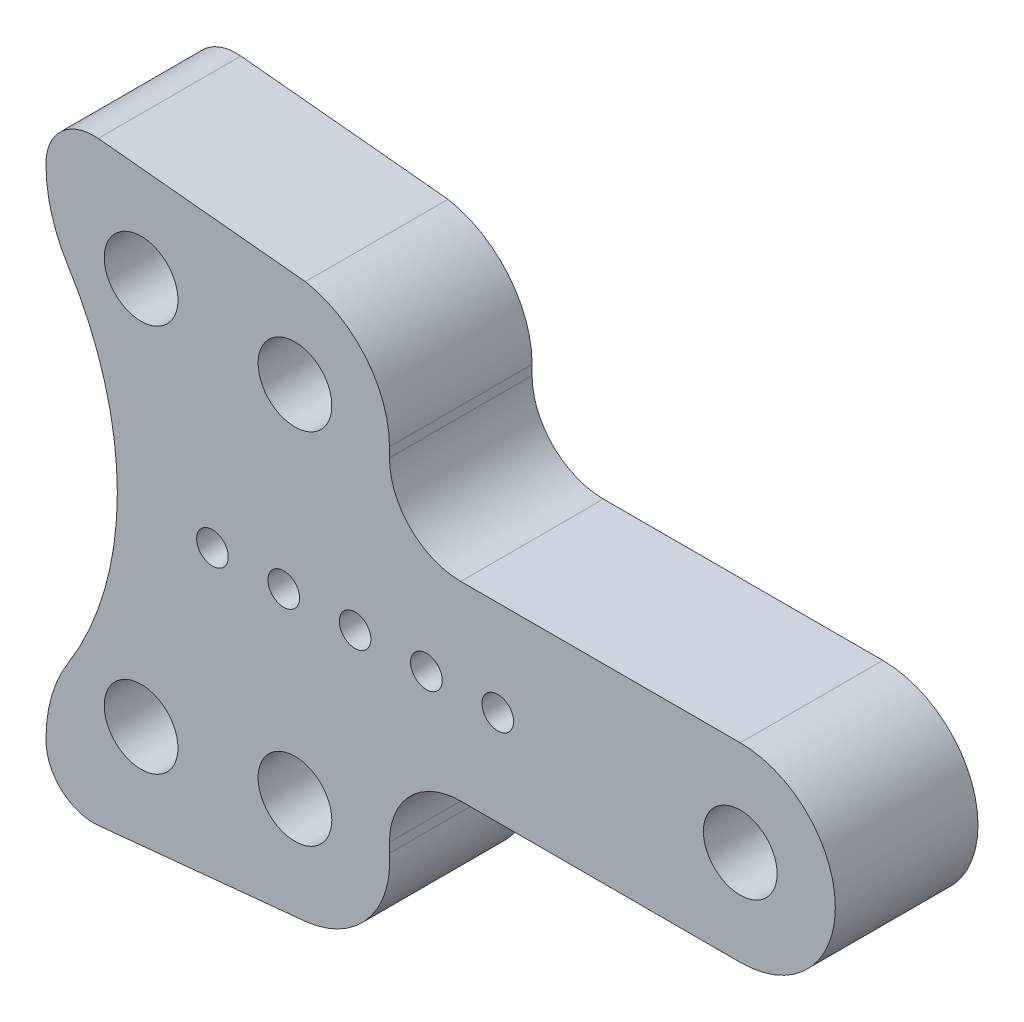
ISO-10303-21;
HEADER;
FILE_DESCRIPTION(('STEP AP214'),'2;1');
FILE_NAME('part.step','',(''),(''),'','','');
FILE_SCHEMA(('AUTOMOTIVE_DESIGN { 1 0 10303 214 1 1 1 1 }'));
ENDSEC;
DATA;
#1=APPLICATION_CONTEXT('core data for automotive mechanical design processes');
#2=APPLICATION_PROTOCOL_DEFINITION('international standard','automotive_design',2000,#1);
#3=PRODUCT_CONTEXT('',#1,'mechanical');
#4=PRODUCT('Part','Part','',(#3));
#5=PRODUCT_RELATED_PRODUCT_CATEGORY('part','',(#4));
#6=PRODUCT_DEFINITION_FORMATION('','',#4);
#7=PRODUCT_DEFINITION_CONTEXT('part definition',#1,'design');
#8=PRODUCT_DEFINITION('design','',#6,#7);
#9=PRODUCT_DEFINITION_SHAPE('','',#8);
#10=(LENGTH_UNIT() NAMED_UNIT(*) SI_UNIT(.MILLI.,.METRE.));
#11=(NAMED_UNIT(*) PLANE_ANGLE_UNIT() SI_UNIT($,.RADIAN.));
#12=(NAMED_UNIT(*) SI_UNIT($,.STERADIAN.) SOLID_ANGLE_UNIT());
#13=UNCERTAINTY_MEASURE_WITH_UNIT(LENGTH_MEASURE(1.E-05),#10,'distance_accuracy_value','');
#14=(GEOMETRIC_REPRESENTATION_CONTEXT(3) GLOBAL_UNCERTAINTY_ASSIGNED_CONTEXT((#13)) GLOBAL_UNIT_ASSIGNED_CONTEXT((#10,
#11,#12)) REPRESENTATION_CONTEXT('',''));
#15=CARTESIAN_POINT('',(0.,0.,0.));
#16=DIRECTION('',(0.,0.,1.));
#17=DIRECTION('',(1.,0.,0.));
#18=AXIS2_PLACEMENT_3D('',#15,#16,#17);
#19=CARTESIAN_POINT('',(-166.275426396836,1553.05348281574,6.));
#20=DIRECTION('',(0.,0.,-1.));
#21=DIRECTION('',(-1.,0.,0.));
#22=AXIS2_PLACEMENT_3D('',#19,#20,#21);
#23=PLANE('',#22);
#24=CARTESIAN_POINT('',(-185.004427546505,1545.64873675556,6.));
#25=DIRECTION('',(0.,0.,-1.));
#26=DIRECTION('',(1.,0.,0.));
#27=AXIS2_PLACEMENT_3D('',#24,#25,#26);
#28=CIRCLE('',#27,1.5500000000001);
#29=CARTESIAN_POINT('',(-183.454427546504,1545.64873675556,6.));
#30=VERTEX_POINT('',#29);
#31=EDGE_CURVE('E364',#30,#30,#28,.T.);
#32=ORIENTED_EDGE('',*,*,#31,.T.);
#33=EDGE_LOOP('',(#32));
#34=FACE_BOUND('',#33,.T.);
#35=CARTESIAN_POINT('',(-191.475426395173,1545.03540658304,6.));
#36=DIRECTION('',(0.,0.,-1.));
#37=DIRECTION('',(1.,0.,0.));
#38=AXIS2_PLACEMENT_3D('',#35,#36,#37);
#39=CIRCLE('',#38,1.5500000000001);
#40=CARTESIAN_POINT('',(-189.925426395173,1545.03540658304,6.));
#41=VERTEX_POINT('',#40);
#42=EDGE_CURVE('E356',#41,#41,#39,.T.);
#43=ORIENTED_EDGE('',*,*,#42,.T.);
#44=EDGE_LOOP('',(#43));
#45=FACE_BOUND('',#44,.T.);
#46=CARTESIAN_POINT('',(-191.475426395173,1561.35590317515,6.));
#47=DIRECTION('',(0.,0.,-1.));
#48=DIRECTION('',(-1.,0.,0.));
#49=AXIS2_PLACEMENT_3D('',#46,#47,#48);
#50=CIRCLE('',#49,1.5500000000001);
#51=CARTESIAN_POINT('',(-193.025426395173,1561.35590317515,6.));
#52=VERTEX_POINT('',#51);
#53=EDGE_CURVE('E348',#52,#52,#50,.T.);
#54=ORIENTED_EDGE('',*,*,#53,.T.);
#55=EDGE_LOOP('',(#54));
#56=FACE_BOUND('',#55,.T.);
#57=CARTESIAN_POINT('',(-185.004427546505,1560.74257300262,6.));
#58=DIRECTION('',(0.,0.,-1.));
#59=DIRECTION('',(-1.,0.,0.));
#60=AXIS2_PLACEMENT_3D('',#57,#58,#59);
#61=CIRCLE('',#60,1.5500000000001);
#62=CARTESIAN_POINT('',(-186.554427546505,1560.74257300262,6.));
#63=VERTEX_POINT('',#62);
#64=EDGE_CURVE('E343',#63,#63,#61,.T.);
#65=ORIENTED_EDGE('',*,*,#64,.T.);
#66=EDGE_LOOP('',(#65));
#67=FACE_BOUND('',#66,.T.);
#68=CARTESIAN_POINT('',(-176.475426396836,1553.05348281574,6.));
#69=DIRECTION('',(0.,0.,1.));
#70=DIRECTION('',(1.,0.,0.));
#71=AXIS2_PLACEMENT_3D('',#68,#69,#70);
#72=CIRCLE('',#71,0.665000000000046);
#73=CARTESIAN_POINT('',(-175.810426396836,1553.05348281574,6.));
#74=VERTEX_POINT('',#73);
#75=EDGE_CURVE('E335',#74,#74,#72,.T.);
#76=ORIENTED_EDGE('',*,*,#75,.F.);
#77=EDGE_LOOP('',(#76));
#78=FACE_BOUND('',#77,.T.);
#79=CARTESIAN_POINT('',(-179.475426396836,1553.05348281574,6.));
#80=DIRECTION('',(0.,0.,1.));
#81=DIRECTION('',(1.,0.,0.));
#82=AXIS2_PLACEMENT_3D('',#79,#80,#81);
#83=CIRCLE('',#82,0.665000000000046);
#84=CARTESIAN_POINT('',(-178.810426396836,1553.05348281574,6.));
#85=VERTEX_POINT('',#84);
#86=EDGE_CURVE('E327',#85,#85,#83,.T.);
#87=ORIENTED_EDGE('',*,*,#86,.F.);
#88=EDGE_LOOP('',(#87));
#89=FACE_BOUND('',#88,.T.);
#90=CARTESIAN_POINT('',(-182.475426396836,1553.05348281574,6.));
#91=DIRECTION('',(0.,0.,1.));
#92=DIRECTION('',(1.,0.,0.));
#93=AXIS2_PLACEMENT_3D('',#90,#91,#92);
#94=CIRCLE('',#93,0.665000000000046);
#95=CARTESIAN_POINT('',(-181.810426396836,1553.05348281574,6.));
#96=VERTEX_POINT('',#95);
#97=EDGE_CURVE('E319',#96,#96,#94,.T.);
#98=ORIENTED_EDGE('',*,*,#97,.F.);
#99=EDGE_LOOP('',(#98));
#100=FACE_BOUND('',#99,.T.);
#101=CARTESIAN_POINT('',(-185.475426396836,1553.05348281574,6.));
#102=DIRECTION('',(0.,0.,1.));
#103=DIRECTION('',(1.,0.,0.));
#104=AXIS2_PLACEMENT_3D('',#101,#102,#103);
#105=CIRCLE('',#104,0.665000000000046);
#106=CARTESIAN_POINT('',(-184.810426396836,1553.05348281574,6.));
#107=VERTEX_POINT('',#106);
#108=EDGE_CURVE('E311',#107,#107,#105,.T.);
#109=ORIENTED_EDGE('',*,*,#108,.F.);
#110=EDGE_LOOP('',(#109));
#111=FACE_BOUND('',#110,.T.);
#112=CARTESIAN_POINT('',(-188.475426396836,1553.05348281574,6.));
#113=DIRECTION('',(0.,0.,1.));
#114=DIRECTION('',(1.,0.,0.));
#115=AXIS2_PLACEMENT_3D('',#112,#113,#114);
#116=CIRCLE('',#115,0.665000000000046);
#117=CARTESIAN_POINT('',(-187.810426396836,1553.05348281574,6.));
#118=VERTEX_POINT('',#117);
#119=EDGE_CURVE('E307',#118,#118,#116,.T.);
#120=ORIENTED_EDGE('',*,*,#119,.F.);
#121=EDGE_LOOP('',(#120));
#122=FACE_BOUND('',#121,.T.);
#123=DIRECTION('',(-1.,0.,0.));
#124=VECTOR('',#123,1.);
#125=CARTESIAN_POINT('',(-188.475426396836,1557.05348281574,6.));
#126=LINE('',#125,#124);
#127=CARTESIAN_POINT('',(-166.275426396836,1557.05348281574,6.));
#128=VERTEX_POINT('',#127);
#129=CARTESIAN_POINT('',(-178.029706775173,1557.05348281574,6.));
#130=VERTEX_POINT('',#129);
#131=EDGE_CURVE('E119',#128,#130,#126,.T.);
#132=ORIENTED_EDGE('',*,*,#131,.T.);
#133=CARTESIAN_POINT('',(-178.029706775165,1560.05348281574,6.));
#134=DIRECTION('',(0.,0.,-1.));
#135=DIRECTION('',(1.,0.,0.));
#136=AXIS2_PLACEMENT_3D('',#133,#134,#135);
#137=CIRCLE('',#136,2.99999999999995);
#138=CARTESIAN_POINT('',(-181.029706775165,1560.05348281574,6.));
#139=VERTEX_POINT('',#138);
#140=EDGE_CURVE('E228',#130,#139,#137,.T.);
#141=ORIENTED_EDGE('',*,*,#140,.T.);
#142=DIRECTION('',(0.,1.,0.));
#143=VECTOR('',#142,1.);
#144=CARTESIAN_POINT('',(-181.029706775165,1560.05348281574,6.));
#145=LINE('',#144,#143);
#146=CARTESIAN_POINT('',(-181.029706775165,1560.45822887591,6.));
#147=VERTEX_POINT('',#146);
#148=EDGE_CURVE('E224',#139,#147,#145,.T.);
#149=ORIENTED_EDGE('',*,*,#148,.T.);
#150=CARTESIAN_POINT('',(-185.347683387734,1560.45822887591,6.));
#151=DIRECTION('',(0.,0.,1.));
#152=DIRECTION('',(-1.,0.,0.));
#153=AXIS2_PLACEMENT_3D('',#150,#151,#152);
#154=CIRCLE('',#153,4.31797661256833);
#155=CARTESIAN_POINT('',(-184.565954248371,1564.70485360378,6.));
#156=VERTEX_POINT('',#155);
#157=EDGE_CURVE('E220',#147,#156,#154,.T.);
#158=ORIENTED_EDGE('',*,*,#157,.T.);
#159=DIRECTION('',(-0.995162407068543,0.0982434911713944,0.));
#160=VECTOR('',#159,1.);
#161=CARTESIAN_POINT('',(-191.112699272425,1565.35115523495,6.));
#162=LINE('',#161,#160);
#163=CARTESIAN_POINT('',(-193.278939414494,1565.56500876555,6.));
#164=VERTEX_POINT('',#163);
#165=EDGE_CURVE('E216',#156,#164,#162,.T.);
#166=ORIENTED_EDGE('',*,*,#165,.T.);
#167=CARTESIAN_POINT('',(-193.475426396836,1563.57468395142,6.));
#168=DIRECTION('',(0.,0.,1.));
#169=DIRECTION('',(-1.,0.,0.));
#170=AXIS2_PLACEMENT_3D('',#167,#168,#169);
#171=CIRCLE('',#170,1.99999999999988);
#172=CARTESIAN_POINT('',(-195.475426396836,1563.57468395142,6.));
#173=VERTEX_POINT('',#172);
#174=EDGE_CURVE('E212',#164,#173,#171,.T.);
#175=ORIENTED_EDGE('',*,*,#174,.T.);
#176=DIRECTION('',(3.52368216721944E-13,-1.,0.));
#177=VECTOR('',#176,1.);
#178=CARTESIAN_POINT('',(-195.475426396836,1563.49591528189,6.));
#179=LINE('',#178,#177);
#180=CARTESIAN_POINT('',(-195.475426396836,1563.49591528189,6.));
#181=VERTEX_POINT('',#180);
#182=EDGE_CURVE('E208',#173,#181,#179,.T.);
#183=ORIENTED_EDGE('',*,*,#182,.T.);
#184=CARTESIAN_POINT('',(-189.475426396836,1563.49591528189,6.));
#185=DIRECTION('',(0.,0.,1.));
#186=DIRECTION('',(-1.,0.,0.));
#187=AXIS2_PLACEMENT_3D('',#184,#185,#186);
#188=CIRCLE('',#187,6.00000000000002);
#189=CARTESIAN_POINT('',(-194.560516381338,1560.31128659874,6.));
#190=VERTEX_POINT('',#189);
#191=EDGE_CURVE('E204',#181,#190,#188,.T.);
#192=ORIENTED_EDGE('',*,*,#191,.T.);
#193=CARTESIAN_POINT('',(-206.149492365173,1553.05348281574,6.));
#194=DIRECTION('',(0.,0.,-1.));
#195=DIRECTION('',(1.,0.,0.));
#196=AXIS2_PLACEMENT_3D('',#193,#194,#195);
#197=CIRCLE('',#196,13.6740659683367);
#198=CARTESIAN_POINT('',(-194.560516381338,1545.79567903274,6.));
#199=VERTEX_POINT('',#198);
#200=EDGE_CURVE('E200',#190,#199,#197,.T.);
#201=ORIENTED_EDGE('',*,*,#200,.T.);
#202=CARTESIAN_POINT('',(-189.475426396836,1542.61105034959,6.));
#203=DIRECTION('',(0.,0.,1.));
#204=DIRECTION('',(-1.,0.,0.));
#205=AXIS2_PLACEMENT_3D('',#202,#203,#204);
#206=CIRCLE('',#205,6.00000000000002);
#207=CARTESIAN_POINT('',(-195.475426396836,1542.61105034959,6.));
#208=VERTEX_POINT('',#207);
#209=EDGE_CURVE('E196',#199,#208,#206,.T.);
#210=ORIENTED_EDGE('',*,*,#209,.T.);
#211=DIRECTION('',(0.,-1.,0.));
#212=VECTOR('',#211,1.);
#213=CARTESIAN_POINT('',(-195.475426396836,1542.53228168014,6.));
#214=LINE('',#213,#212);
#215=CARTESIAN_POINT('',(-195.475426396836,1542.53228168014,6.));
#216=VERTEX_POINT('',#215);
#217=EDGE_CURVE('E191',#208,#216,#214,.T.);
#218=ORIENTED_EDGE('',*,*,#217,.T.);
#219=CARTESIAN_POINT('',(-193.475426396836,1542.53228168014,6.));
#220=DIRECTION('',(0.,0.,1.));
#221=DIRECTION('',(1.,0.,0.));
#222=AXIS2_PLACEMENT_3D('',#219,#220,#221);
#223=CIRCLE('',#222,2.);
#224=CARTESIAN_POINT('',(-193.278939414493,1540.541956866,6.));
#225=VERTEX_POINT('',#224);
#226=EDGE_CURVE('E245',#216,#225,#223,.T.);
#227=ORIENTED_EDGE('',*,*,#226,.T.);
#228=DIRECTION('',(0.995162407068538,0.0982434911714458,0.));
#229=VECTOR('',#228,1.);
#230=CARTESIAN_POINT('',(-184.565954248368,1541.40211202778,6.));
#231=LINE('',#230,#229);
#232=CARTESIAN_POINT('',(-184.565954248368,1541.40211202778,6.));
#233=VERTEX_POINT('',#232);
#234=EDGE_CURVE('E241',#225,#233,#231,.T.);
#235=ORIENTED_EDGE('',*,*,#234,.T.);
#236=CARTESIAN_POINT('',(-184.993467934784,1545.35377461965,6.));
#237=DIRECTION('',(0.,0.,1.));
#238=DIRECTION('',(1.,0.,0.));
#239=AXIS2_PLACEMENT_3D('',#236,#237,#238);
#240=CIRCLE('',#239,3.97472076906977);
#241=CARTESIAN_POINT('',(-181.029706775172,1545.64873675557,6.));
#242=VERTEX_POINT('',#241);
#243=EDGE_CURVE('E237',#233,#242,#240,.T.);
#244=ORIENTED_EDGE('',*,*,#243,.T.);
#245=DIRECTION('',(0.,1.,0.));
#246=VECTOR('',#245,1.);
#247=CARTESIAN_POINT('',(-181.029706775172,1546.05348281574,6.));
#248=LINE('',#247,#246);
#249=CARTESIAN_POINT('',(-181.029706775172,1546.05348281574,6.));
#250=VERTEX_POINT('',#249);
#251=EDGE_CURVE('E234',#242,#250,#248,.T.);
#252=ORIENTED_EDGE('',*,*,#251,.T.);
#253=CARTESIAN_POINT('',(-178.029706775172,1546.05348281574,6.));
#254=DIRECTION('',(0.,0.,-1.));
#255=DIRECTION('',(-1.,0.,0.));
#256=AXIS2_PLACEMENT_3D('',#253,#254,#255);
#257=CIRCLE('',#256,2.99999999999992);
#258=CARTESIAN_POINT('',(-178.029706775173,1549.05348281574,6.));
#259=VERTEX_POINT('',#258);
#260=EDGE_CURVE('E59',#250,#259,#257,.T.);
#261=ORIENTED_EDGE('',*,*,#260,.T.);
#262=DIRECTION('',(1.,0.,0.));
#263=VECTOR('',#262,1.);
#264=CARTESIAN_POINT('',(-166.275426396836,1549.05348281574,6.));
#265=LINE('',#264,#263);
#266=CARTESIAN_POINT('',(-166.275426396836,1549.05348281574,6.));
#267=VERTEX_POINT('',#266);
#268=EDGE_CURVE('E68',#259,#267,#265,.T.);
#269=ORIENTED_EDGE('',*,*,#268,.T.);
#270=CARTESIAN_POINT('',(-166.275426396836,1553.05348281574,6.));
#271=DIRECTION('',(0.,0.,1.));
#272=DIRECTION('',(-1.,0.,0.));
#273=AXIS2_PLACEMENT_3D('',#270,#271,#272);
#274=CIRCLE('',#273,4.);
#275=EDGE_CURVE('E94',#267,#128,#274,.T.);
#276=ORIENTED_EDGE('',*,*,#275,.T.);
#277=EDGE_LOOP('',(#132,#141,#149,#158,#166,#175,#183,#192,#201,#210,#218,#227,#235,#244,#252,
#261,#269,#276));
#278=FACE_BOUND('',#277,.T.);
#279=CARTESIAN_POINT('',(-166.275426396836,1553.05348281574,6.));
#280=DIRECTION('',(0.,0.,1.));
#281=DIRECTION('',(1.,0.,0.));
#282=AXIS2_PLACEMENT_3D('',#279,#280,#281);
#283=CIRCLE('',#282,1.5500000000001);
#284=CARTESIAN_POINT('',(-164.725426396836,1553.05348281574,6.));
#285=VERTEX_POINT('',#284);
#286=EDGE_CURVE('E108',#285,#285,#283,.T.);
#287=ORIENTED_EDGE('',*,*,#286,.F.);
#288=EDGE_LOOP('',(#287));
#289=FACE_BOUND('',#288,.T.);
#290=ADVANCED_FACE('F39',(#34,#45,#56,#67,#78,#89,#100,#111,#122,#278,#289),#23,.F.);
#291=CARTESIAN_POINT('',(-166.275426396836,1553.05348281574,0.));
#292=DIRECTION('',(0.,0.,-1.));
#293=DIRECTION('',(-1.,0.,0.));
#294=AXIS2_PLACEMENT_3D('',#291,#292,#293);
#295=PLANE('',#294);
#296=CARTESIAN_POINT('',(-185.004427546505,1545.64873675556,0.));
#297=DIRECTION('',(0.,0.,-1.));
#298=DIRECTION('',(1.,0.,0.));
#299=AXIS2_PLACEMENT_3D('',#296,#297,#298);
#300=CIRCLE('',#299,1.5500000000001);
#301=CARTESIAN_POINT('',(-183.454427546504,1545.64873675556,0.));
#302=VERTEX_POINT('',#301);
#303=EDGE_CURVE('E368',#302,#302,#300,.T.);
#304=ORIENTED_EDGE('',*,*,#303,.F.);
#305=EDGE_LOOP('',(#304));
#306=FACE_BOUND('',#305,.T.);
#307=CARTESIAN_POINT('',(-191.475426395173,1545.03540658304,0.));
#308=DIRECTION('',(0.,0.,-1.));
#309=DIRECTION('',(1.,0.,0.));
#310=AXIS2_PLACEMENT_3D('',#307,#308,#309);
#311=CIRCLE('',#310,1.5500000000001);
#312=CARTESIAN_POINT('',(-189.925426395173,1545.03540658304,0.));
#313=VERTEX_POINT('',#312);
#314=EDGE_CURVE('E360',#313,#313,#311,.T.);
#315=ORIENTED_EDGE('',*,*,#314,.F.);
#316=EDGE_LOOP('',(#315));
#317=FACE_BOUND('',#316,.T.);
#318=CARTESIAN_POINT('',(-191.475426395173,1561.35590317515,0.));
#319=DIRECTION('',(0.,0.,-1.));
#320=DIRECTION('',(-1.,0.,0.));
#321=AXIS2_PLACEMENT_3D('',#318,#319,#320);
#322=CIRCLE('',#321,1.5500000000001);
#323=CARTESIAN_POINT('',(-193.025426395173,1561.35590317515,0.));
#324=VERTEX_POINT('',#323);
#325=EDGE_CURVE('E352',#324,#324,#322,.T.);
#326=ORIENTED_EDGE('',*,*,#325,.F.);
#327=EDGE_LOOP('',(#326));
#328=FACE_BOUND('',#327,.T.);
#329=CARTESIAN_POINT('',(-185.004427546505,1560.74257300262,0.));
#330=DIRECTION('',(0.,0.,-1.));
#331=DIRECTION('',(-1.,0.,0.));
#332=AXIS2_PLACEMENT_3D('',#329,#330,#331);
#333=CIRCLE('',#332,1.5500000000001);
#334=CARTESIAN_POINT('',(-186.554427546505,1560.74257300262,0.));
#335=VERTEX_POINT('',#334);
#336=EDGE_CURVE('E344',#335,#335,#333,.T.);
#337=ORIENTED_EDGE('',*,*,#336,.F.);
#338=EDGE_LOOP('',(#337));
#339=FACE_BOUND('',#338,.T.);
#340=CARTESIAN_POINT('',(-176.475426396836,1553.05348281574,0.));
#341=DIRECTION('',(0.,0.,-1.));
#342=DIRECTION('',(-1.,0.,0.));
#343=AXIS2_PLACEMENT_3D('',#340,#341,#342);
#344=CIRCLE('',#343,0.665000000000046);
#345=CARTESIAN_POINT('',(-177.140426396836,1553.05348281574,0.));
#346=VERTEX_POINT('',#345);
#347=EDGE_CURVE('E339',#346,#346,#344,.T.);
#348=ORIENTED_EDGE('',*,*,#347,.F.);
#349=EDGE_LOOP('',(#348));
#350=FACE_BOUND('',#349,.T.);
#351=CARTESIAN_POINT('',(-179.475426396836,1553.05348281574,0.));
#352=DIRECTION('',(0.,0.,-1.));
#353=DIRECTION('',(-1.,0.,0.));
#354=AXIS2_PLACEMENT_3D('',#351,#352,#353);
#355=CIRCLE('',#354,0.665000000000046);
#356=CARTESIAN_POINT('',(-180.140426396836,1553.05348281574,0.));
#357=VERTEX_POINT('',#356);
#358=EDGE_CURVE('E331',#357,#357,#355,.T.);
#359=ORIENTED_EDGE('',*,*,#358,.F.);
#360=EDGE_LOOP('',(#359));
#361=FACE_BOUND('',#360,.T.);
#362=CARTESIAN_POINT('',(-182.475426396836,1553.05348281574,0.));
#363=DIRECTION('',(0.,0.,-1.));
#364=DIRECTION('',(-1.,0.,0.));
#365=AXIS2_PLACEMENT_3D('',#362,#363,#364);
#366=CIRCLE('',#365,0.665000000000046);
#367=CARTESIAN_POINT('',(-183.140426396836,1553.05348281574,0.));
#368=VERTEX_POINT('',#367);
#369=EDGE_CURVE('E323',#368,#368,#366,.T.);
#370=ORIENTED_EDGE('',*,*,#369,.F.);
#371=EDGE_LOOP('',(#370));
#372=FACE_BOUND('',#371,.T.);
#373=CARTESIAN_POINT('',(-185.475426396836,1553.05348281574,0.));
#374=DIRECTION('',(0.,0.,-1.));
#375=DIRECTION('',(-1.,0.,0.));
#376=AXIS2_PLACEMENT_3D('',#373,#374,#375);
#377=CIRCLE('',#376,0.665000000000046);
#378=CARTESIAN_POINT('',(-186.140426396836,1553.05348281574,0.));
#379=VERTEX_POINT('',#378);
#380=EDGE_CURVE('E315',#379,#379,#377,.T.);
#381=ORIENTED_EDGE('',*,*,#380,.F.);
#382=EDGE_LOOP('',(#381));
#383=FACE_BOUND('',#382,.T.);
#384=CARTESIAN_POINT('',(-188.475426396836,1553.05348281574,0.));
#385=DIRECTION('',(0.,0.,-1.));
#386=DIRECTION('',(-1.,0.,0.));
#387=AXIS2_PLACEMENT_3D('',#384,#385,#386);
#388=CIRCLE('',#387,0.665000000000046);
#389=CARTESIAN_POINT('',(-189.140426396836,1553.05348281574,0.));
#390=VERTEX_POINT('',#389);
#391=EDGE_CURVE('E43',#390,#390,#388,.T.);
#392=ORIENTED_EDGE('',*,*,#391,.F.);
#393=EDGE_LOOP('',(#392));
#394=FACE_BOUND('',#393,.T.);
#395=DIRECTION('',(1.,0.,0.));
#396=VECTOR('',#395,1.);
#397=CARTESIAN_POINT('',(-166.275426396836,1549.05348281574,0.));
#398=LINE('',#397,#396);
#399=CARTESIAN_POINT('',(-178.029706775173,1549.05348281574,0.));
#400=VERTEX_POINT('',#399);
#401=CARTESIAN_POINT('',(-166.275426396836,1549.05348281574,0.));
#402=VERTEX_POINT('',#401);
#403=EDGE_CURVE('E84',#400,#402,#398,.T.);
#404=ORIENTED_EDGE('',*,*,#403,.F.);
#405=CARTESIAN_POINT('',(-178.029706775172,1546.05348281574,0.));
#406=DIRECTION('',(0.,0.,-1.));
#407=DIRECTION('',(-1.,0.,0.));
#408=AXIS2_PLACEMENT_3D('',#405,#406,#407);
#409=CIRCLE('',#408,2.99999999999992);
#410=CARTESIAN_POINT('',(-181.029706775172,1546.05348281574,0.));
#411=VERTEX_POINT('',#410);
#412=EDGE_CURVE('E288',#411,#400,#409,.T.);
#413=ORIENTED_EDGE('',*,*,#412,.F.);
#414=DIRECTION('',(0.,1.,0.));
#415=VECTOR('',#414,1.);
#416=CARTESIAN_POINT('',(-181.029706775172,1546.05348281574,0.));
#417=LINE('',#416,#415);
#418=CARTESIAN_POINT('',(-181.029706775172,1545.64873675557,0.));
#419=VERTEX_POINT('',#418);
#420=EDGE_CURVE('E292',#419,#411,#417,.T.);
#421=ORIENTED_EDGE('',*,*,#420,.F.);
#422=CARTESIAN_POINT('',(-184.993467934784,1545.35377461965,0.));
#423=DIRECTION('',(0.,0.,1.));
#424=DIRECTION('',(1.,0.,0.));
#425=AXIS2_PLACEMENT_3D('',#422,#423,#424);
#426=CIRCLE('',#425,3.97472076906977);
#427=CARTESIAN_POINT('',(-184.565954248368,1541.40211202778,0.));
#428=VERTEX_POINT('',#427);
#429=EDGE_CURVE('E296',#428,#419,#426,.T.);
#430=ORIENTED_EDGE('',*,*,#429,.F.);
#431=DIRECTION('',(0.995162407068542,0.0982434911714071,0.));
#432=VECTOR('',#431,1.);
#433=CARTESIAN_POINT('',(-188.141654626991,1541.04911508368,0.));
#434=LINE('',#433,#432);
#435=CARTESIAN_POINT('',(-193.278939414493,1540.541956866,0.));
#436=VERTEX_POINT('',#435);
#437=EDGE_CURVE('E300',#436,#428,#434,.T.);
#438=ORIENTED_EDGE('',*,*,#437,.F.);
#439=CARTESIAN_POINT('',(-193.475426396836,1542.53228168014,0.));
#440=DIRECTION('',(0.,0.,1.));
#441=DIRECTION('',(1.,0.,0.));
#442=AXIS2_PLACEMENT_3D('',#439,#440,#441);
#443=CIRCLE('',#442,2.);
#444=CARTESIAN_POINT('',(-195.475426396836,1542.53228168014,0.));
#445=VERTEX_POINT('',#444);
#446=EDGE_CURVE('E195',#445,#436,#443,.T.);
#447=ORIENTED_EDGE('',*,*,#446,.F.);
#448=DIRECTION('',(0.,-1.,0.));
#449=VECTOR('',#448,1.);
#450=CARTESIAN_POINT('',(-195.475426396836,1542.53228168014,0.));
#451=LINE('',#450,#449);
#452=CARTESIAN_POINT('',(-195.475426396836,1542.61105034959,0.));
#453=VERTEX_POINT('',#452);
#454=EDGE_CURVE('E134',#453,#445,#451,.T.);
#455=ORIENTED_EDGE('',*,*,#454,.F.);
#456=CARTESIAN_POINT('',(-189.475426396836,1542.61105034959,0.));
#457=DIRECTION('',(0.,0.,1.));
#458=DIRECTION('',(-1.,0.,0.));
#459=AXIS2_PLACEMENT_3D('',#456,#457,#458);
#460=CIRCLE('',#459,6.00000000000002);
#461=CARTESIAN_POINT('',(-194.560516381338,1545.79567903274,0.));
#462=VERTEX_POINT('',#461);
#463=EDGE_CURVE('E252',#462,#453,#460,.T.);
#464=ORIENTED_EDGE('',*,*,#463,.F.);
#465=CARTESIAN_POINT('',(-206.149492365173,1553.05348281574,0.));
#466=DIRECTION('',(0.,0.,-1.));
#467=DIRECTION('',(1.,0.,0.));
#468=AXIS2_PLACEMENT_3D('',#465,#466,#467);
#469=CIRCLE('',#468,13.6740659683367);
#470=CARTESIAN_POINT('',(-194.560516381338,1560.31128659874,0.));
#471=VERTEX_POINT('',#470);
#472=EDGE_CURVE('E256',#471,#462,#469,.T.);
#473=ORIENTED_EDGE('',*,*,#472,.F.);
#474=CARTESIAN_POINT('',(-189.475426396836,1563.49591528189,0.));
#475=DIRECTION('',(0.,0.,1.));
#476=DIRECTION('',(-1.,0.,0.));
#477=AXIS2_PLACEMENT_3D('',#474,#475,#476);
#478=CIRCLE('',#477,6.00000000000002);
#479=CARTESIAN_POINT('',(-195.475426396836,1563.49591528189,0.));
#480=VERTEX_POINT('',#479);
#481=EDGE_CURVE('E260',#480,#471,#478,.T.);
#482=ORIENTED_EDGE('',*,*,#481,.F.);
#483=DIRECTION('',(3.52368216721944E-13,-1.,0.));
#484=VECTOR('',#483,1.);
#485=CARTESIAN_POINT('',(-195.475426396836,1563.49591528189,0.));
#486=LINE('',#485,#484);
#487=CARTESIAN_POINT('',(-195.475426396836,1563.57468395142,0.));
#488=VERTEX_POINT('',#487);
#489=EDGE_CURVE('E264',#488,#480,#486,.T.);
#490=ORIENTED_EDGE('',*,*,#489,.F.);
#491=CARTESIAN_POINT('',(-193.475426396836,1563.57468395142,0.));
#492=DIRECTION('',(0.,0.,1.));
#493=DIRECTION('',(-1.,0.,0.));
#494=AXIS2_PLACEMENT_3D('',#491,#492,#493);
#495=CIRCLE('',#494,1.99999999999988);
#496=CARTESIAN_POINT('',(-193.278939414494,1565.56500876555,0.));
#497=VERTEX_POINT('',#496);
#498=EDGE_CURVE('E268',#497,#488,#495,.T.);
#499=ORIENTED_EDGE('',*,*,#498,.F.);
#500=DIRECTION('',(-0.995162407068545,0.0982434911713713,0.));
#501=VECTOR('',#500,1.);
#502=CARTESIAN_POINT('',(-184.565954248371,1564.70485360378,0.));
#503=LINE('',#502,#501);
#504=CARTESIAN_POINT('',(-184.565954248371,1564.70485360378,0.));
#505=VERTEX_POINT('',#504);
#506=EDGE_CURVE('E272',#505,#497,#503,.T.);
#507=ORIENTED_EDGE('',*,*,#506,.F.);
#508=CARTESIAN_POINT('',(-185.347683387734,1560.45822887591,0.));
#509=DIRECTION('',(0.,0.,1.));
#510=DIRECTION('',(-1.,0.,0.));
#511=AXIS2_PLACEMENT_3D('',#508,#509,#510);
#512=CIRCLE('',#511,4.31797661256833);
#513=CARTESIAN_POINT('',(-181.029706775165,1560.45822887591,0.));
#514=VERTEX_POINT('',#513);
#515=EDGE_CURVE('E276',#514,#505,#512,.T.);
#516=ORIENTED_EDGE('',*,*,#515,.F.);
#517=DIRECTION('',(0.,1.,0.));
#518=VECTOR('',#517,1.);
#519=CARTESIAN_POINT('',(-181.029706775165,1560.05348281574,0.));
#520=LINE('',#519,#518);
#521=CARTESIAN_POINT('',(-181.029706775165,1560.05348281574,0.));
#522=VERTEX_POINT('',#521);
#523=EDGE_CURVE('E280',#522,#514,#520,.T.);
#524=ORIENTED_EDGE('',*,*,#523,.F.);
#525=CARTESIAN_POINT('',(-178.029706775165,1560.05348281574,0.));
#526=DIRECTION('',(0.,0.,-1.));
#527=DIRECTION('',(1.,0.,0.));
#528=AXIS2_PLACEMENT_3D('',#525,#526,#527);
#529=CIRCLE('',#528,2.99999999999995);
#530=CARTESIAN_POINT('',(-178.029706775173,1557.05348281574,0.));
#531=VERTEX_POINT('',#530);
#532=EDGE_CURVE('E284',#531,#522,#529,.T.);
#533=ORIENTED_EDGE('',*,*,#532,.F.);
#534=DIRECTION('',(-1.,0.,0.));
#535=VECTOR('',#534,1.);
#536=CARTESIAN_POINT('',(-188.475426396836,1557.05348281574,0.));
#537=LINE('',#536,#535);
#538=CARTESIAN_POINT('',(-166.275426396836,1557.05348281574,0.));
#539=VERTEX_POINT('',#538);
#540=EDGE_CURVE('E95',#539,#531,#537,.T.);
#541=ORIENTED_EDGE('',*,*,#540,.F.);
#542=CARTESIAN_POINT('',(-166.275426396836,1553.05348281574,0.));
#543=DIRECTION('',(0.,0.,1.));
#544=DIRECTION('',(-1.,0.,0.));
#545=AXIS2_PLACEMENT_3D('',#542,#543,#544);
#546=CIRCLE('',#545,4.);
#547=EDGE_CURVE('E100',#402,#539,#546,.T.);
#548=ORIENTED_EDGE('',*,*,#547,.F.);
#549=EDGE_LOOP('',(#404,#413,#421,#430,#438,#447,#455,#464,#473,#482,#490,#499,#507,#516,#524,
#533,#541,#548));
#550=FACE_BOUND('',#549,.T.);
#551=CARTESIAN_POINT('',(-166.275426396836,1553.05348281574,0.));
#552=DIRECTION('',(0.,0.,1.));
#553=DIRECTION('',(1.,0.,0.));
#554=AXIS2_PLACEMENT_3D('',#551,#552,#553);
#555=CIRCLE('',#554,1.5500000000001);
#556=CARTESIAN_POINT('',(-164.725426396836,1553.05348281574,0.));
#557=VERTEX_POINT('',#556);
#558=EDGE_CURVE('E114',#557,#557,#555,.T.);
#559=ORIENTED_EDGE('',*,*,#558,.T.);
#560=EDGE_LOOP('',(#559));
#561=FACE_BOUND('',#560,.T.);
#562=ADVANCED_FACE('F103',(#306,#317,#328,#339,#350,#361,#372,#383,#394,#550,#561),#295,.T.);
#563=CARTESIAN_POINT('',(-166.275426396836,1553.05348281574,6.));
#564=DIRECTION('',(0.,0.,-1.));
#565=DIRECTION('',(-1.,0.,0.));
#566=AXIS2_PLACEMENT_3D('',#563,#564,#565);
#567=CYLINDRICAL_SURFACE('',#566,4.);
#568=ORIENTED_EDGE('',*,*,#547,.T.);
#569=DIRECTION('',(0.,0.,-1.));
#570=VECTOR('',#569,1.);
#571=CARTESIAN_POINT('',(-166.275426396836,1557.05348281574,6.));
#572=LINE('',#571,#570);
#573=EDGE_CURVE('E11',#128,#539,#572,.T.);
#574=ORIENTED_EDGE('',*,*,#573,.F.);
#575=ORIENTED_EDGE('',*,*,#275,.F.);
#576=DIRECTION('',(0.,0.,-1.));
#577=VECTOR('',#576,1.);
#578=CARTESIAN_POINT('',(-166.275426396836,1549.05348281574,6.));
#579=LINE('',#578,#577);
#580=EDGE_CURVE('E49',#267,#402,#579,.T.);
#581=ORIENTED_EDGE('',*,*,#580,.T.);
#582=EDGE_LOOP('',(#568,#574,#575,#581));
#583=FACE_BOUND('',#582,.T.);
#584=ADVANCED_FACE('F41',(#583),#567,.T.);
#585=CARTESIAN_POINT('',(-188.475426396836,1557.05348281574,6.));
#586=DIRECTION('',(0.,-1.,0.));
#587=DIRECTION('',(0.,0.,-1.));
#588=AXIS2_PLACEMENT_3D('',#585,#586,#587);
#589=PLANE('',#588);
#590=ORIENTED_EDGE('',*,*,#540,.T.);
#591=DIRECTION('',(0.,0.,1.));
#592=VECTOR('',#591,1.);
#593=CARTESIAN_POINT('',(-178.029706775173,1557.05348281574,0.));
#594=LINE('',#593,#592);
#595=EDGE_CURVE('E148',#531,#130,#594,.T.);
#596=ORIENTED_EDGE('',*,*,#595,.T.);
#597=ORIENTED_EDGE('',*,*,#131,.F.);
#598=ORIENTED_EDGE('',*,*,#573,.T.);
#599=EDGE_LOOP('',(#590,#596,#597,#598));
#600=FACE_BOUND('',#599,.T.);
#601=ADVANCED_FACE('F433',(#600),#589,.F.);
#602=CARTESIAN_POINT('',(-166.275426396836,1549.05348281574,6.));
#603=DIRECTION('',(0.,1.,0.));
#604=DIRECTION('',(0.,0.,1.));
#605=AXIS2_PLACEMENT_3D('',#602,#603,#604);
#606=PLANE('',#605);
#607=ORIENTED_EDGE('',*,*,#268,.F.);
#608=DIRECTION('',(0.,0.,1.));
#609=VECTOR('',#608,1.);
#610=CARTESIAN_POINT('',(-178.029706775173,1549.05348281574,0.));
#611=LINE('',#610,#609);
#612=EDGE_CURVE('E89',#400,#259,#611,.T.);
#613=ORIENTED_EDGE('',*,*,#612,.F.);
#614=ORIENTED_EDGE('',*,*,#403,.T.);
#615=ORIENTED_EDGE('',*,*,#580,.F.);
#616=EDGE_LOOP('',(#607,#613,#614,#615));
#617=FACE_BOUND('',#616,.T.);
#618=ADVANCED_FACE('F86',(#617),#606,.F.);
#619=CARTESIAN_POINT('',(-166.275426396836,1553.05348281574,6.));
#620=DIRECTION('',(0.,0.,-1.));
#621=DIRECTION('',(-1.,0.,0.));
#622=AXIS2_PLACEMENT_3D('',#619,#620,#621);
#623=CYLINDRICAL_SURFACE('',#622,1.5500000000001);
#624=ORIENTED_EDGE('',*,*,#286,.T.);
#625=EDGE_LOOP('',(#624));
#626=FACE_BOUND('',#625,.T.);
#627=ORIENTED_EDGE('',*,*,#558,.F.);
#628=EDGE_LOOP('',(#627));
#629=FACE_BOUND('',#628,.T.);
#630=ADVANCED_FACE('F420',(#626,#629),#623,.F.);
#631=CARTESIAN_POINT('',(-206.149492365173,1553.05348281574,0.));
#632=DIRECTION('',(0.,0.,1.));
#633=DIRECTION('',(1.,0.,0.));
#634=AXIS2_PLACEMENT_3D('',#631,#632,#633);
#635=CYLINDRICAL_SURFACE('',#634,13.6740659683367);
#636=DIRECTION('',(0.,0.,1.));
#637=VECTOR('',#636,1.);
#638=CARTESIAN_POINT('',(-194.560516381338,1545.79567903274,0.));
#639=LINE('',#638,#637);
#640=EDGE_CURVE('E180',#462,#199,#639,.T.);
#641=ORIENTED_EDGE('',*,*,#640,.T.);
#642=ORIENTED_EDGE('',*,*,#200,.F.);
#643=DIRECTION('',(0.,0.,1.));
#644=VECTOR('',#643,1.);
#645=CARTESIAN_POINT('',(-194.560516381338,1560.31128659874,0.));
#646=LINE('',#645,#644);
#647=EDGE_CURVE('E176',#471,#190,#646,.T.);
#648=ORIENTED_EDGE('',*,*,#647,.F.);
#649=ORIENTED_EDGE('',*,*,#472,.T.);
#650=EDGE_LOOP('',(#641,#642,#648,#649));
#651=FACE_BOUND('',#650,.T.);
#652=ADVANCED_FACE('F423',(#651),#635,.F.);
#653=CARTESIAN_POINT('',(-193.475426396836,1542.53228168014,0.));
#654=DIRECTION('',(0.,0.,1.));
#655=DIRECTION('',(1.,0.,0.));
#656=AXIS2_PLACEMENT_3D('',#653,#654,#655);
#657=CYLINDRICAL_SURFACE('',#656,2.);
#658=ORIENTED_EDGE('',*,*,#226,.F.);
#659=DIRECTION('',(0.,0.,1.));
#660=VECTOR('',#659,1.);
#661=CARTESIAN_POINT('',(-195.475426396836,1542.53228168014,0.));
#662=LINE('',#661,#660);
#663=EDGE_CURVE('E127',#445,#216,#662,.T.);
#664=ORIENTED_EDGE('',*,*,#663,.F.);
#665=ORIENTED_EDGE('',*,*,#446,.T.);
#666=DIRECTION('',(0.,0.,1.));
#667=VECTOR('',#666,1.);
#668=CARTESIAN_POINT('',(-193.278939414493,1540.541956866,0.));
#669=LINE('',#668,#667);
#670=EDGE_CURVE('E129',#436,#225,#669,.T.);
#671=ORIENTED_EDGE('',*,*,#670,.T.);
#672=EDGE_LOOP('',(#658,#664,#665,#671));
#673=FACE_BOUND('',#672,.T.);
#674=ADVANCED_FACE('F430',(#673),#657,.T.);
#675=CARTESIAN_POINT('',(-195.475426396836,1542.53228168014,0.));
#676=DIRECTION('',(-1.,0.,0.));
#677=DIRECTION('',(0.,0.,1.));
#678=AXIS2_PLACEMENT_3D('',#675,#676,#677);
#679=PLANE('',#678);
#680=ORIENTED_EDGE('',*,*,#217,.F.);
#681=DIRECTION('',(0.,0.,1.));
#682=VECTOR('',#681,1.);
#683=CARTESIAN_POINT('',(-195.475426396836,1542.61105034959,0.));
#684=LINE('',#683,#682);
#685=EDGE_CURVE('E184',#453,#208,#684,.T.);
#686=ORIENTED_EDGE('',*,*,#685,.F.);
#687=ORIENTED_EDGE('',*,*,#454,.T.);
#688=ORIENTED_EDGE('',*,*,#663,.T.);
#689=EDGE_LOOP('',(#680,#686,#687,#688));
#690=FACE_BOUND('',#689,.T.);
#691=ADVANCED_FACE('F564',(#690),#679,.T.);
#692=CARTESIAN_POINT('',(-189.475426396836,1542.61105034959,0.));
#693=DIRECTION('',(0.,0.,1.));
#694=DIRECTION('',(1.,0.,0.));
#695=AXIS2_PLACEMENT_3D('',#692,#693,#694);
#696=CYLINDRICAL_SURFACE('',#695,6.00000000000002);
#697=ORIENTED_EDGE('',*,*,#209,.F.);
#698=ORIENTED_EDGE('',*,*,#640,.F.);
#699=ORIENTED_EDGE('',*,*,#463,.T.);
#700=ORIENTED_EDGE('',*,*,#685,.T.);
#701=EDGE_LOOP('',(#697,#698,#699,#700));
#702=FACE_BOUND('',#701,.T.);
#703=ADVANCED_FACE('F568',(#702),#696,.T.);
#704=CARTESIAN_POINT('',(-189.475426396836,1563.49591528189,0.));
#705=DIRECTION('',(0.,0.,1.));
#706=DIRECTION('',(1.,0.,0.));
#707=AXIS2_PLACEMENT_3D('',#704,#705,#706);
#708=CYLINDRICAL_SURFACE('',#707,6.00000000000002);
#709=ORIENTED_EDGE('',*,*,#191,.F.);
#710=DIRECTION('',(0.,0.,1.));
#711=VECTOR('',#710,1.);
#712=CARTESIAN_POINT('',(-195.475426396836,1563.49591528189,0.));
#713=LINE('',#712,#711);
#714=EDGE_CURVE('E172',#480,#181,#713,.T.);
#715=ORIENTED_EDGE('',*,*,#714,.F.);
#716=ORIENTED_EDGE('',*,*,#481,.T.);
#717=ORIENTED_EDGE('',*,*,#647,.T.);
#718=EDGE_LOOP('',(#709,#715,#716,#717));
#719=FACE_BOUND('',#718,.T.);
#720=ADVANCED_FACE('F575',(#719),#708,.T.);
#721=CARTESIAN_POINT('',(-195.475426396836,1563.49591528189,0.));
#722=DIRECTION('',(-1.,-3.52368216721944E-13,0.));
#723=DIRECTION('',(3.52368216721944E-13,-1.,0.));
#724=AXIS2_PLACEMENT_3D('',#721,#722,#723);
#725=PLANE('',#724);
#726=ORIENTED_EDGE('',*,*,#182,.F.);
#727=DIRECTION('',(0.,0.,1.));
#728=VECTOR('',#727,1.);
#729=CARTESIAN_POINT('',(-195.475426396836,1563.57468395142,0.));
#730=LINE('',#729,#728);
#731=EDGE_CURVE('E168',#488,#173,#730,.T.);
#732=ORIENTED_EDGE('',*,*,#731,.F.);
#733=ORIENTED_EDGE('',*,*,#489,.T.);
#734=ORIENTED_EDGE('',*,*,#714,.T.);
#735=EDGE_LOOP('',(#726,#732,#733,#734));
#736=FACE_BOUND('',#735,.T.);
#737=ADVANCED_FACE('F578',(#736),#725,.T.);
#738=CARTESIAN_POINT('',(-193.475426396836,1563.57468395142,0.));
#739=DIRECTION('',(0.,0.,1.));
#740=DIRECTION('',(1.,0.,0.));
#741=AXIS2_PLACEMENT_3D('',#738,#739,#740);
#742=CYLINDRICAL_SURFACE('',#741,1.99999999999988);
#743=ORIENTED_EDGE('',*,*,#174,.F.);
#744=DIRECTION('',(0.,0.,1.));
#745=VECTOR('',#744,1.);
#746=CARTESIAN_POINT('',(-193.278939414494,1565.56500876555,0.));
#747=LINE('',#746,#745);
#748=EDGE_CURVE('E164',#497,#164,#747,.T.);
#749=ORIENTED_EDGE('',*,*,#748,.F.);
#750=ORIENTED_EDGE('',*,*,#498,.T.);
#751=ORIENTED_EDGE('',*,*,#731,.T.);
#752=EDGE_LOOP('',(#743,#749,#750,#751));
#753=FACE_BOUND('',#752,.T.);
#754=ADVANCED_FACE('F584',(#753),#742,.T.);
#755=CARTESIAN_POINT('',(-191.112699272425,1565.35115523495,0.));
#756=DIRECTION('',(0.0982434911713944,0.995162407068543,0.));
#757=DIRECTION('',(-0.995162407068543,0.0982434911713944,0.));
#758=AXIS2_PLACEMENT_3D('',#755,#756,#757);
#759=PLANE('',#758);
#760=ORIENTED_EDGE('',*,*,#165,.F.);
#761=DIRECTION('',(0.,0.,1.));
#762=VECTOR('',#761,1.);
#763=CARTESIAN_POINT('',(-184.565954248371,1564.70485360378,0.));
#764=LINE('',#763,#762);
#765=EDGE_CURVE('E160',#505,#156,#764,.T.);
#766=ORIENTED_EDGE('',*,*,#765,.F.);
#767=ORIENTED_EDGE('',*,*,#506,.T.);
#768=ORIENTED_EDGE('',*,*,#748,.T.);
#769=EDGE_LOOP('',(#760,#766,#767,#768));
#770=FACE_BOUND('',#769,.T.);
#771=ADVANCED_FACE('F586',(#770),#759,.T.);
#772=CARTESIAN_POINT('',(-185.347683387734,1560.45822887591,0.));
#773=DIRECTION('',(0.,0.,1.));
#774=DIRECTION('',(1.,0.,0.));
#775=AXIS2_PLACEMENT_3D('',#772,#773,#774);
#776=CYLINDRICAL_SURFACE('',#775,4.31797661256833);
#777=ORIENTED_EDGE('',*,*,#157,.F.);
#778=DIRECTION('',(0.,0.,1.));
#779=VECTOR('',#778,1.);
#780=CARTESIAN_POINT('',(-181.029706775165,1560.45822887591,0.));
#781=LINE('',#780,#779);
#782=EDGE_CURVE('E156',#514,#147,#781,.T.);
#783=ORIENTED_EDGE('',*,*,#782,.F.);
#784=ORIENTED_EDGE('',*,*,#515,.T.);
#785=ORIENTED_EDGE('',*,*,#765,.T.);
#786=EDGE_LOOP('',(#777,#783,#784,#785));
#787=FACE_BOUND('',#786,.T.);
#788=ADVANCED_FACE('F591',(#787),#776,.T.);
#789=CARTESIAN_POINT('',(-181.029706775165,1560.05348281574,0.));
#790=DIRECTION('',(1.,0.,0.));
#791=DIRECTION('',(0.,0.,-1.));
#792=AXIS2_PLACEMENT_3D('',#789,#790,#791);
#793=PLANE('',#792);
#794=ORIENTED_EDGE('',*,*,#148,.F.);
#795=DIRECTION('',(0.,0.,1.));
#796=VECTOR('',#795,1.);
#797=CARTESIAN_POINT('',(-181.029706775165,1560.05348281574,0.));
#798=LINE('',#797,#796);
#799=EDGE_CURVE('E152',#522,#139,#798,.T.);
#800=ORIENTED_EDGE('',*,*,#799,.F.);
#801=ORIENTED_EDGE('',*,*,#523,.T.);
#802=ORIENTED_EDGE('',*,*,#782,.T.);
#803=EDGE_LOOP('',(#794,#800,#801,#802));
#804=FACE_BOUND('',#803,.T.);
#805=ADVANCED_FACE('F594',(#804),#793,.T.);
#806=CARTESIAN_POINT('',(-178.029706775165,1560.05348281574,0.));
#807=DIRECTION('',(0.,0.,1.));
#808=DIRECTION('',(1.,0.,0.));
#809=AXIS2_PLACEMENT_3D('',#806,#807,#808);
#810=CYLINDRICAL_SURFACE('',#809,2.99999999999995);
#811=ORIENTED_EDGE('',*,*,#140,.F.);
#812=ORIENTED_EDGE('',*,*,#595,.F.);
#813=ORIENTED_EDGE('',*,*,#532,.T.);
#814=ORIENTED_EDGE('',*,*,#799,.T.);
#815=EDGE_LOOP('',(#811,#812,#813,#814));
#816=FACE_BOUND('',#815,.T.);
#817=ADVANCED_FACE('F595',(#816),#810,.F.);
#818=CARTESIAN_POINT('',(-178.029706775172,1546.05348281574,0.));
#819=DIRECTION('',(0.,0.,1.));
#820=DIRECTION('',(1.,0.,0.));
#821=AXIS2_PLACEMENT_3D('',#818,#819,#820);
#822=CYLINDRICAL_SURFACE('',#821,2.99999999999992);
#823=ORIENTED_EDGE('',*,*,#260,.F.);
#824=DIRECTION('',(0.,0.,1.));
#825=VECTOR('',#824,1.);
#826=CARTESIAN_POINT('',(-181.029706775172,1546.05348281574,0.));
#827=LINE('',#826,#825);
#828=EDGE_CURVE('E142',#411,#250,#827,.T.);
#829=ORIENTED_EDGE('',*,*,#828,.F.);
#830=ORIENTED_EDGE('',*,*,#412,.T.);
#831=ORIENTED_EDGE('',*,*,#612,.T.);
#832=EDGE_LOOP('',(#823,#829,#830,#831));
#833=FACE_BOUND('',#832,.T.);
#834=ADVANCED_FACE('F550',(#833),#822,.F.);
#835=CARTESIAN_POINT('',(-181.029706775172,1546.05348281574,0.));
#836=DIRECTION('',(1.,0.,0.));
#837=DIRECTION('',(0.,0.,-1.));
#838=AXIS2_PLACEMENT_3D('',#835,#836,#837);
#839=PLANE('',#838);
#840=ORIENTED_EDGE('',*,*,#251,.F.);
#841=DIRECTION('',(0.,0.,1.));
#842=VECTOR('',#841,1.);
#843=CARTESIAN_POINT('',(-181.029706775172,1545.64873675557,0.));
#844=LINE('',#843,#842);
#845=EDGE_CURVE('E138',#419,#242,#844,.T.);
#846=ORIENTED_EDGE('',*,*,#845,.F.);
#847=ORIENTED_EDGE('',*,*,#420,.T.);
#848=ORIENTED_EDGE('',*,*,#828,.T.);
#849=EDGE_LOOP('',(#840,#846,#847,#848));
#850=FACE_BOUND('',#849,.T.);
#851=ADVANCED_FACE('F555',(#850),#839,.T.);
#852=CARTESIAN_POINT('',(-184.993467934784,1545.35377461965,0.));
#853=DIRECTION('',(0.,0.,1.));
#854=DIRECTION('',(1.,0.,0.));
#855=AXIS2_PLACEMENT_3D('',#852,#853,#854);
#856=CYLINDRICAL_SURFACE('',#855,3.97472076906977);
#857=ORIENTED_EDGE('',*,*,#243,.F.);
#858=DIRECTION('',(0.,0.,1.));
#859=VECTOR('',#858,1.);
#860=CARTESIAN_POINT('',(-184.565954248368,1541.40211202778,0.));
#861=LINE('',#860,#859);
#862=EDGE_CURVE('E133',#428,#233,#861,.T.);
#863=ORIENTED_EDGE('',*,*,#862,.F.);
#864=ORIENTED_EDGE('',*,*,#429,.T.);
#865=ORIENTED_EDGE('',*,*,#845,.T.);
#866=EDGE_LOOP('',(#857,#863,#864,#865));
#867=FACE_BOUND('',#866,.T.);
#868=ADVANCED_FACE('F558',(#867),#856,.T.);
#869=CARTESIAN_POINT('',(-184.565954248368,1541.40211202778,0.));
#870=DIRECTION('',(0.0982434911714458,-0.995162407068538,0.));
#871=DIRECTION('',(0.995162407068538,0.0982434911714458,0.));
#872=AXIS2_PLACEMENT_3D('',#869,#870,#871);
#873=PLANE('',#872);
#874=ORIENTED_EDGE('',*,*,#234,.F.);
#875=ORIENTED_EDGE('',*,*,#670,.F.);
#876=ORIENTED_EDGE('',*,*,#437,.T.);
#877=ORIENTED_EDGE('',*,*,#862,.T.);
#878=EDGE_LOOP('',(#874,#875,#876,#877));
#879=FACE_BOUND('',#878,.T.);
#880=ADVANCED_FACE('F410',(#879),#873,.T.);
#881=CARTESIAN_POINT('',(-188.475426396836,1553.05348281574,-4.));
#882=DIRECTION('',(0.,0.,1.));
#883=DIRECTION('',(1.,0.,0.));
#884=AXIS2_PLACEMENT_3D('',#881,#882,#883);
#885=CYLINDRICAL_SURFACE('',#884,0.665000000000046);
#886=ORIENTED_EDGE('',*,*,#391,.T.);
#887=EDGE_LOOP('',(#886));
#888=FACE_BOUND('',#887,.T.);
#889=ORIENTED_EDGE('',*,*,#119,.T.);
#890=EDGE_LOOP('',(#889));
#891=FACE_BOUND('',#890,.T.);
#892=ADVANCED_FACE('F406',(#888,#891),#885,.F.);
#893=CARTESIAN_POINT('',(-185.475426396836,1553.05348281574,-4.));
#894=DIRECTION('',(0.,0.,1.));
#895=DIRECTION('',(1.,0.,0.));
#896=AXIS2_PLACEMENT_3D('',#893,#894,#895);
#897=CYLINDRICAL_SURFACE('',#896,0.665000000000046);
#898=ORIENTED_EDGE('',*,*,#380,.T.);
#899=EDGE_LOOP('',(#898));
#900=FACE_BOUND('',#899,.T.);
#901=ORIENTED_EDGE('',*,*,#108,.T.);
#902=EDGE_LOOP('',(#901));
#903=FACE_BOUND('',#902,.T.);
#904=ADVANCED_FACE('F409',(#900,#903),#897,.F.);
#905=CARTESIAN_POINT('',(-182.475426396836,1553.05348281574,-4.));
#906=DIRECTION('',(0.,0.,1.));
#907=DIRECTION('',(1.,0.,0.));
#908=AXIS2_PLACEMENT_3D('',#905,#906,#907);
#909=CYLINDRICAL_SURFACE('',#908,0.665000000000046);
#910=ORIENTED_EDGE('',*,*,#369,.T.);
#911=EDGE_LOOP('',(#910));
#912=FACE_BOUND('',#911,.T.);
#913=ORIENTED_EDGE('',*,*,#97,.T.);
#914=EDGE_LOOP('',(#913));
#915=FACE_BOUND('',#914,.T.);
#916=ADVANCED_FACE('F624',(#912,#915),#909,.F.);
#917=CARTESIAN_POINT('',(-179.475426396836,1553.05348281574,-4.));
#918=DIRECTION('',(0.,0.,1.));
#919=DIRECTION('',(1.,0.,0.));
#920=AXIS2_PLACEMENT_3D('',#917,#918,#919);
#921=CYLINDRICAL_SURFACE('',#920,0.665000000000046);
#922=ORIENTED_EDGE('',*,*,#358,.T.);
#923=EDGE_LOOP('',(#922));
#924=FACE_BOUND('',#923,.T.);
#925=ORIENTED_EDGE('',*,*,#86,.T.);
#926=EDGE_LOOP('',(#925));
#927=FACE_BOUND('',#926,.T.);
#928=ADVANCED_FACE('F632',(#924,#927),#921,.F.);
#929=CARTESIAN_POINT('',(-176.475426396836,1553.05348281574,-4.));
#930=DIRECTION('',(0.,0.,1.));
#931=DIRECTION('',(1.,0.,0.));
#932=AXIS2_PLACEMENT_3D('',#929,#930,#931);
#933=CYLINDRICAL_SURFACE('',#932,0.665000000000046);
#934=ORIENTED_EDGE('',*,*,#347,.T.);
#935=EDGE_LOOP('',(#934));
#936=FACE_BOUND('',#935,.T.);
#937=ORIENTED_EDGE('',*,*,#75,.T.);
#938=EDGE_LOOP('',(#937));
#939=FACE_BOUND('',#938,.T.);
#940=ADVANCED_FACE('F640',(#936,#939),#933,.F.);
#941=CARTESIAN_POINT('',(-185.004427546505,1560.74257300262,6.));
#942=DIRECTION('',(0.,0.,-1.));
#943=DIRECTION('',(-1.,0.,0.));
#944=AXIS2_PLACEMENT_3D('',#941,#942,#943);
#945=CYLINDRICAL_SURFACE('',#944,1.5500000000001);
#946=ORIENTED_EDGE('',*,*,#64,.F.);
#947=EDGE_LOOP('',(#946));
#948=FACE_BOUND('',#947,.T.);
#949=ORIENTED_EDGE('',*,*,#336,.T.);
#950=EDGE_LOOP('',(#949));
#951=FACE_BOUND('',#950,.T.);
#952=ADVANCED_FACE('F648',(#948,#951),#945,.F.);
#953=CARTESIAN_POINT('',(-191.475426395173,1561.35590317515,6.));
#954=DIRECTION('',(0.,0.,-1.));
#955=DIRECTION('',(-1.,0.,0.));
#956=AXIS2_PLACEMENT_3D('',#953,#954,#955);
#957=CYLINDRICAL_SURFACE('',#956,1.5500000000001);
#958=ORIENTED_EDGE('',*,*,#53,.F.);
#959=EDGE_LOOP('',(#958));
#960=FACE_BOUND('',#959,.T.);
#961=ORIENTED_EDGE('',*,*,#325,.T.);
#962=EDGE_LOOP('',(#961));
#963=FACE_BOUND('',#962,.T.);
#964=ADVANCED_FACE('F657',(#960,#963),#957,.F.);
#965=CARTESIAN_POINT('',(-191.475426395173,1545.03540658304,6.));
#966=DIRECTION('',(0.,0.,-1.));
#967=DIRECTION('',(-1.,0.,0.));
#968=AXIS2_PLACEMENT_3D('',#965,#966,#967);
#969=CYLINDRICAL_SURFACE('',#968,1.5500000000001);
#970=ORIENTED_EDGE('',*,*,#42,.F.);
#971=EDGE_LOOP('',(#970));
#972=FACE_BOUND('',#971,.T.);
#973=ORIENTED_EDGE('',*,*,#314,.T.);
#974=EDGE_LOOP('',(#973));
#975=FACE_BOUND('',#974,.T.);
#976=ADVANCED_FACE('F381',(#972,#975),#969,.F.);
#977=CARTESIAN_POINT('',(-185.004427546505,1545.64873675556,6.));
#978=DIRECTION('',(0.,0.,-1.));
#979=DIRECTION('',(-1.,0.,0.));
#980=AXIS2_PLACEMENT_3D('',#977,#978,#979);
#981=CYLINDRICAL_SURFACE('',#980,1.5500000000001);
#982=ORIENTED_EDGE('',*,*,#31,.F.);
#983=EDGE_LOOP('',(#982));
#984=FACE_BOUND('',#983,.T.);
#985=ORIENTED_EDGE('',*,*,#303,.T.);
#986=EDGE_LOOP('',(#985));
#987=FACE_BOUND('',#986,.T.);
#988=ADVANCED_FACE('F378',(#984,#987),#981,.F.);
#989=CLOSED_SHELL('',(#290,#562,#584,#601,#618,#630,#652,#674,#691,#703,#720,#737,#754,#771,
#788,#805,#817,#834,#851,#868,#880,#892,#904,#916,#928,#940,#952,#964,#976,#988));
#990=MANIFOLD_SOLID_BREP('B2',#989);
#991=ADVANCED_BREP_SHAPE_REPRESENTATION('',(#18,#990),#14);
#992=SHAPE_DEFINITION_REPRESENTATION(#9,#991);
ENDSEC;
END-ISO-10303-21;
